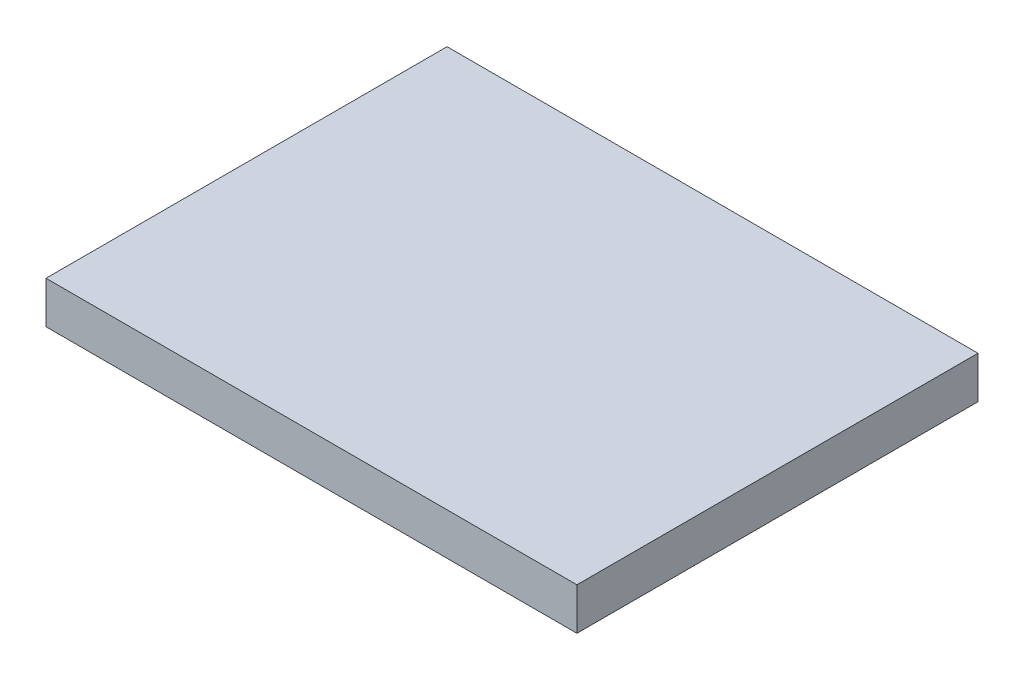
ISO-10303-21;
HEADER;
FILE_DESCRIPTION(('STEP AP214'),'2;1');
FILE_NAME('part.step','',(''),(''),'','','');
FILE_SCHEMA(('AUTOMOTIVE_DESIGN { 1 0 10303 214 1 1 1 1 }'));
ENDSEC;
DATA;
#1=APPLICATION_CONTEXT('core data for automotive mechanical design processes');
#2=APPLICATION_PROTOCOL_DEFINITION('international standard','automotive_design',2000,#1);
#3=PRODUCT_CONTEXT('',#1,'mechanical');
#4=PRODUCT('Part','Part','',(#3));
#5=PRODUCT_RELATED_PRODUCT_CATEGORY('part','',(#4));
#6=PRODUCT_DEFINITION_FORMATION('','',#4);
#7=PRODUCT_DEFINITION_CONTEXT('part definition',#1,'design');
#8=PRODUCT_DEFINITION('design','',#6,#7);
#9=PRODUCT_DEFINITION_SHAPE('','',#8);
#10=(LENGTH_UNIT() NAMED_UNIT(*) SI_UNIT(.MILLI.,.METRE.));
#11=(NAMED_UNIT(*) PLANE_ANGLE_UNIT() SI_UNIT($,.RADIAN.));
#12=(NAMED_UNIT(*) SI_UNIT($,.STERADIAN.) SOLID_ANGLE_UNIT());
#13=UNCERTAINTY_MEASURE_WITH_UNIT(LENGTH_MEASURE(1.E-05),#10,'distance_accuracy_value','');
#14=(GEOMETRIC_REPRESENTATION_CONTEXT(3) GLOBAL_UNCERTAINTY_ASSIGNED_CONTEXT((#13)) GLOBAL_UNIT_ASSIGNED_CONTEXT((#10,
#11,#12)) REPRESENTATION_CONTEXT('',''));
#15=CARTESIAN_POINT('',(0.,0.,0.));
#16=DIRECTION('',(0.,0.,1.));
#17=DIRECTION('',(1.,0.,0.));
#18=AXIS2_PLACEMENT_3D('',#15,#16,#17);
#19=CARTESIAN_POINT('',(88.265,13.97,66.675));
#20=DIRECTION('',(-1.,0.,0.));
#21=DIRECTION('',(0.,0.,1.));
#22=AXIS2_PLACEMENT_3D('',#19,#20,#21);
#23=PLANE('',#22);
#24=DIRECTION('',(0.,0.,-1.));
#25=VECTOR('',#24,1.);
#26=CARTESIAN_POINT('',(88.265,0.,66.675));
#27=LINE('',#26,#25);
#28=CARTESIAN_POINT('',(88.265,0.,66.675));
#29=VERTEX_POINT('',#28);
#30=CARTESIAN_POINT('',(88.265,0.,-66.675));
#31=VERTEX_POINT('',#30);
#32=EDGE_CURVE('E109',#29,#31,#27,.T.);
#33=ORIENTED_EDGE('',*,*,#32,.T.);
#34=DIRECTION('',(0.,-1.,0.));
#35=VECTOR('',#34,1.);
#36=CARTESIAN_POINT('',(88.265,13.97,-66.675));
#37=LINE('',#36,#35);
#38=CARTESIAN_POINT('',(88.265,13.97,-66.675));
#39=VERTEX_POINT('',#38);
#40=EDGE_CURVE('E11',#39,#31,#37,.T.);
#41=ORIENTED_EDGE('',*,*,#40,.F.);
#42=DIRECTION('',(0.,0.,-1.));
#43=VECTOR('',#42,1.);
#44=CARTESIAN_POINT('',(88.265,13.97,66.675));
#45=LINE('',#44,#43);
#46=CARTESIAN_POINT('',(88.265,13.97,66.675));
#47=VERTEX_POINT('',#46);
#48=EDGE_CURVE('E93',#47,#39,#45,.T.);
#49=ORIENTED_EDGE('',*,*,#48,.F.);
#50=DIRECTION('',(0.,-1.,0.));
#51=VECTOR('',#50,1.);
#52=CARTESIAN_POINT('',(88.265,13.97,66.675));
#53=LINE('',#52,#51);
#54=EDGE_CURVE('E105',#47,#29,#53,.T.);
#55=ORIENTED_EDGE('',*,*,#54,.T.);
#56=EDGE_LOOP('',(#33,#41,#49,#55));
#57=FACE_BOUND('',#56,.T.);
#58=ADVANCED_FACE('F41',(#57),#23,.F.);
#59=CARTESIAN_POINT('',(-88.265,13.97,-66.675));
#60=DIRECTION('',(0.,0.,1.));
#61=DIRECTION('',(1.,0.,0.));
#62=AXIS2_PLACEMENT_3D('',#59,#60,#61);
#63=PLANE('',#62);
#64=DIRECTION('',(-1.,0.,0.));
#65=VECTOR('',#64,1.);
#66=CARTESIAN_POINT('',(-88.265,0.,-66.675));
#67=LINE('',#66,#65);
#68=CARTESIAN_POINT('',(-88.265,0.,-66.675));
#69=VERTEX_POINT('',#68);
#70=EDGE_CURVE('E98',#31,#69,#67,.T.);
#71=ORIENTED_EDGE('',*,*,#70,.T.);
#72=DIRECTION('',(0.,-1.,0.));
#73=VECTOR('',#72,1.);
#74=CARTESIAN_POINT('',(-88.265,13.97,-66.675));
#75=LINE('',#74,#73);
#76=CARTESIAN_POINT('',(-88.265,13.97,-66.675));
#77=VERTEX_POINT('',#76);
#78=EDGE_CURVE('E50',#77,#69,#75,.T.);
#79=ORIENTED_EDGE('',*,*,#78,.F.);
#80=DIRECTION('',(-1.,0.,0.));
#81=VECTOR('',#80,1.);
#82=CARTESIAN_POINT('',(-88.265,13.97,-66.675));
#83=LINE('',#82,#81);
#84=EDGE_CURVE('E88',#39,#77,#83,.T.);
#85=ORIENTED_EDGE('',*,*,#84,.F.);
#86=ORIENTED_EDGE('',*,*,#40,.T.);
#87=EDGE_LOOP('',(#71,#79,#85,#86));
#88=FACE_BOUND('',#87,.T.);
#89=ADVANCED_FACE('F97',(#88),#63,.F.);
#90=CARTESIAN_POINT('',(-88.265,13.97,66.675));
#91=DIRECTION('',(1.,0.,0.));
#92=DIRECTION('',(0.,0.,-1.));
#93=AXIS2_PLACEMENT_3D('',#90,#91,#92);
#94=PLANE('',#93);
#95=DIRECTION('',(0.,0.,1.));
#96=VECTOR('',#95,1.);
#97=CARTESIAN_POINT('',(-88.265,0.,66.675));
#98=LINE('',#97,#96);
#99=CARTESIAN_POINT('',(-88.265,0.,66.675));
#100=VERTEX_POINT('',#99);
#101=EDGE_CURVE('E75',#69,#100,#98,.T.);
#102=ORIENTED_EDGE('',*,*,#101,.T.);
#103=DIRECTION('',(0.,-1.,0.));
#104=VECTOR('',#103,1.);
#105=CARTESIAN_POINT('',(-88.265,13.97,66.675));
#106=LINE('',#105,#104);
#107=CARTESIAN_POINT('',(-88.265,13.97,66.675));
#108=VERTEX_POINT('',#107);
#109=EDGE_CURVE('E100',#108,#100,#106,.T.);
#110=ORIENTED_EDGE('',*,*,#109,.F.);
#111=DIRECTION('',(0.,0.,1.));
#112=VECTOR('',#111,1.);
#113=CARTESIAN_POINT('',(-88.265,13.97,66.675));
#114=LINE('',#113,#112);
#115=EDGE_CURVE('E91',#77,#108,#114,.T.);
#116=ORIENTED_EDGE('',*,*,#115,.F.);
#117=ORIENTED_EDGE('',*,*,#78,.T.);
#118=EDGE_LOOP('',(#102,#110,#116,#117));
#119=FACE_BOUND('',#118,.T.);
#120=ADVANCED_FACE('F101',(#119),#94,.F.);
#121=CARTESIAN_POINT('',(-88.265,13.97,66.675));
#122=DIRECTION('',(0.,0.,-1.));
#123=DIRECTION('',(-1.,0.,0.));
#124=AXIS2_PLACEMENT_3D('',#121,#122,#123);
#125=PLANE('',#124);
#126=DIRECTION('',(1.,0.,0.));
#127=VECTOR('',#126,1.);
#128=CARTESIAN_POINT('',(-88.265,0.,66.675));
#129=LINE('',#128,#127);
#130=EDGE_CURVE('E81',#100,#29,#129,.T.);
#131=ORIENTED_EDGE('',*,*,#130,.T.);
#132=ORIENTED_EDGE('',*,*,#54,.F.);
#133=DIRECTION('',(1.,0.,0.));
#134=VECTOR('',#133,1.);
#135=CARTESIAN_POINT('',(-88.265,13.97,66.675));
#136=LINE('',#135,#134);
#137=EDGE_CURVE('E58',#108,#47,#136,.T.);
#138=ORIENTED_EDGE('',*,*,#137,.F.);
#139=ORIENTED_EDGE('',*,*,#109,.T.);
#140=EDGE_LOOP('',(#131,#132,#138,#139));
#141=FACE_BOUND('',#140,.T.);
#142=ADVANCED_FACE('F122',(#141),#125,.F.);
#143=CARTESIAN_POINT('',(0.,13.97,0.));
#144=DIRECTION('',(0.,-1.,0.));
#145=DIRECTION('',(0.,0.,-1.));
#146=AXIS2_PLACEMENT_3D('',#143,#144,#145);
#147=PLANE('',#146);
#148=ORIENTED_EDGE('',*,*,#48,.T.);
#149=ORIENTED_EDGE('',*,*,#84,.T.);
#150=ORIENTED_EDGE('',*,*,#115,.T.);
#151=ORIENTED_EDGE('',*,*,#137,.T.);
#152=EDGE_LOOP('',(#148,#149,#150,#151));
#153=FACE_BOUND('',#152,.T.);
#154=ADVANCED_FACE('F89',(#153),#147,.F.);
#155=CARTESIAN_POINT('',(0.,0.,0.));
#156=DIRECTION('',(0.,-1.,0.));
#157=DIRECTION('',(0.,0.,-1.));
#158=AXIS2_PLACEMENT_3D('',#155,#156,#157);
#159=PLANE('',#158);
#160=ORIENTED_EDGE('',*,*,#32,.F.);
#161=ORIENTED_EDGE('',*,*,#130,.F.);
#162=ORIENTED_EDGE('',*,*,#101,.F.);
#163=ORIENTED_EDGE('',*,*,#70,.F.);
#164=EDGE_LOOP('',(#160,#161,#162,#163));
#165=FACE_BOUND('',#164,.T.);
#166=ADVANCED_FACE('F125',(#165),#159,.T.);
#167=CLOSED_SHELL('',(#58,#89,#120,#142,#154,#166));
#168=MANIFOLD_SOLID_BREP('B2',#167);
#169=ADVANCED_BREP_SHAPE_REPRESENTATION('',(#18,#168),#14);
#170=SHAPE_DEFINITION_REPRESENTATION(#9,#169);
ENDSEC;
END-ISO-10303-21;
